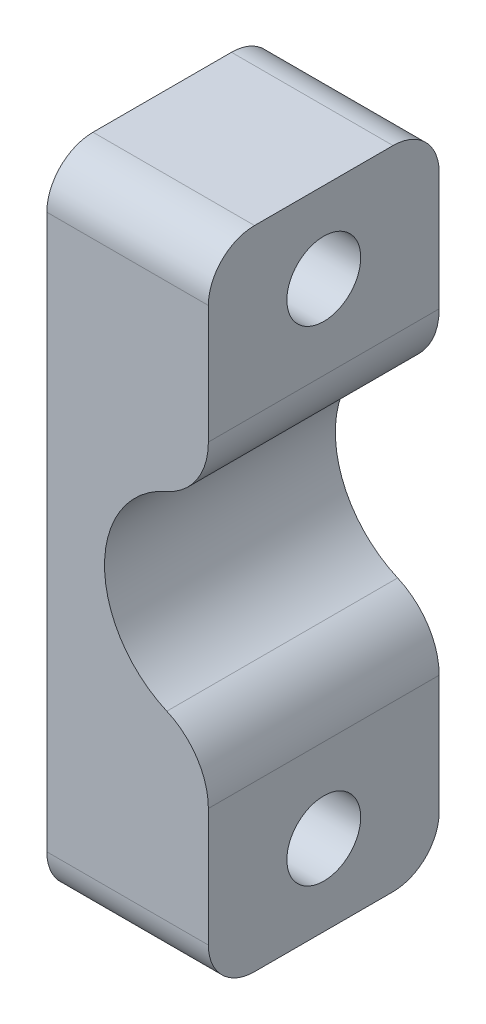
ISO-10303-21;
HEADER;
FILE_DESCRIPTION(('STEP AP214'),'2;1');
FILE_NAME('part.step','',(''),(''),'','','');
FILE_SCHEMA(('AUTOMOTIVE_DESIGN { 1 0 10303 214 1 1 1 1 }'));
ENDSEC;
DATA;
#1=APPLICATION_CONTEXT('core data for automotive mechanical design processes');
#2=APPLICATION_PROTOCOL_DEFINITION('international standard','automotive_design',2000,#1);
#3=PRODUCT_CONTEXT('',#1,'mechanical');
#4=PRODUCT('Part','Part','',(#3));
#5=PRODUCT_RELATED_PRODUCT_CATEGORY('part','',(#4));
#6=PRODUCT_DEFINITION_FORMATION('','',#4);
#7=PRODUCT_DEFINITION_CONTEXT('part definition',#1,'design');
#8=PRODUCT_DEFINITION('design','',#6,#7);
#9=PRODUCT_DEFINITION_SHAPE('','',#8);
#10=(LENGTH_UNIT() NAMED_UNIT(*) SI_UNIT(.MILLI.,.METRE.));
#11=(NAMED_UNIT(*) PLANE_ANGLE_UNIT() SI_UNIT($,.RADIAN.));
#12=(NAMED_UNIT(*) SI_UNIT($,.STERADIAN.) SOLID_ANGLE_UNIT());
#13=UNCERTAINTY_MEASURE_WITH_UNIT(LENGTH_MEASURE(1.E-05),#10,'distance_accuracy_value','');
#14=(GEOMETRIC_REPRESENTATION_CONTEXT(3) GLOBAL_UNCERTAINTY_ASSIGNED_CONTEXT((#13)) GLOBAL_UNIT_ASSIGNED_CONTEXT((#10,
#11,#12)) REPRESENTATION_CONTEXT('',''));
#15=CARTESIAN_POINT('',(0.,0.,0.));
#16=DIRECTION('',(0.,0.,1.));
#17=DIRECTION('',(1.,0.,0.));
#18=AXIS2_PLACEMENT_3D('',#15,#16,#17);
#19=CARTESIAN_POINT('',(16.8883451930902,14.,5.));
#20=DIRECTION('',(-1.,0.,0.));
#21=DIRECTION('',(0.,0.,1.));
#22=AXIS2_PLACEMENT_3D('',#19,#20,#21);
#23=PLANE('',#22);
#24=CARTESIAN_POINT('',(16.8883451930902,-10.5,0.));
#25=DIRECTION('',(1.,0.,0.));
#26=DIRECTION('',(0.,0.,-1.));
#27=AXIS2_PLACEMENT_3D('',#24,#25,#26);
#28=CIRCLE('',#27,1.6);
#29=CARTESIAN_POINT('',(16.8883451930902,-10.5,-1.6));
#30=VERTEX_POINT('',#29);
#31=EDGE_CURVE('E244',#30,#30,#28,.T.);
#32=ORIENTED_EDGE('',*,*,#31,.F.);
#33=EDGE_LOOP('',(#32));
#34=FACE_BOUND('',#33,.T.);
#35=DIRECTION('',(0.,0.,-1.));
#36=VECTOR('',#35,1.);
#37=CARTESIAN_POINT('',(16.8883451930902,-14.,5.));
#38=LINE('',#37,#36);
#39=CARTESIAN_POINT('',(16.8883451930902,-14.,3.));
#40=VERTEX_POINT('',#39);
#41=CARTESIAN_POINT('',(16.8883451930902,-14.,-3.));
#42=VERTEX_POINT('',#41);
#43=EDGE_CURVE('E159',#40,#42,#38,.T.);
#44=ORIENTED_EDGE('',*,*,#43,.T.);
#45=CARTESIAN_POINT('',(16.8883451930902,-12.,-3.));
#46=DIRECTION('',(-1.,0.,0.));
#47=DIRECTION('',(0.,0.,1.));
#48=AXIS2_PLACEMENT_3D('',#45,#46,#47);
#49=CIRCLE('',#48,2.);
#50=CARTESIAN_POINT('',(16.8883451930902,-12.,-5.));
#51=VERTEX_POINT('',#50);
#52=EDGE_CURVE('E60',#42,#51,#49,.F.);
#53=ORIENTED_EDGE('',*,*,#52,.T.);
#54=DIRECTION('',(0.,1.,0.));
#55=VECTOR('',#54,1.);
#56=CARTESIAN_POINT('',(16.8883451930902,14.,-5.));
#57=LINE('',#56,#55);
#58=CARTESIAN_POINT('',(16.8883451930902,-6.87386354243376,-5.));
#59=VERTEX_POINT('',#58);
#60=EDGE_CURVE('E128',#51,#59,#57,.T.);
#61=ORIENTED_EDGE('',*,*,#60,.T.);
#62=DIRECTION('',(0.,0.,1.));
#63=VECTOR('',#62,1.);
#64=CARTESIAN_POINT('',(16.8883451930902,-6.87386354243376,5.));
#65=LINE('',#64,#63);
#66=CARTESIAN_POINT('',(16.8883451930902,-6.87386354243376,5.));
#67=VERTEX_POINT('',#66);
#68=EDGE_CURVE('E133',#59,#67,#65,.T.);
#69=ORIENTED_EDGE('',*,*,#68,.T.);
#70=DIRECTION('',(0.,1.,0.));
#71=VECTOR('',#70,1.);
#72=CARTESIAN_POINT('',(16.8883451930902,14.,5.));
#73=LINE('',#72,#71);
#74=CARTESIAN_POINT('',(16.8883451930902,-12.,5.));
#75=VERTEX_POINT('',#74);
#76=EDGE_CURVE('E216',#75,#67,#73,.T.);
#77=ORIENTED_EDGE('',*,*,#76,.F.);
#78=CARTESIAN_POINT('',(16.8883451930902,-12.,3.));
#79=DIRECTION('',(-1.,0.,0.));
#80=DIRECTION('',(0.,0.,1.));
#81=AXIS2_PLACEMENT_3D('',#78,#79,#80);
#82=CIRCLE('',#81,2.);
#83=EDGE_CURVE('E53',#75,#40,#82,.F.);
#84=ORIENTED_EDGE('',*,*,#83,.T.);
#85=EDGE_LOOP('',(#44,#53,#61,#69,#77,#84));
#86=FACE_BOUND('',#85,.T.);
#87=ADVANCED_FACE('F37',(#34,#86),#23,.F.);
#88=CARTESIAN_POINT('',(9.8883451930902,14.,5.));
#89=DIRECTION('',(1.,0.,0.));
#90=DIRECTION('',(0.,0.,-1.));
#91=AXIS2_PLACEMENT_3D('',#88,#89,#90);
#92=PLANE('',#91);
#93=CARTESIAN_POINT('',(9.8883451930902,-10.5,0.));
#94=DIRECTION('',(1.,0.,0.));
#95=DIRECTION('',(0.,0.,-1.));
#96=AXIS2_PLACEMENT_3D('',#93,#94,#95);
#97=CIRCLE('',#96,1.6);
#98=CARTESIAN_POINT('',(9.8883451930902,-10.5,-1.6));
#99=VERTEX_POINT('',#98);
#100=EDGE_CURVE('E41',#99,#99,#97,.T.);
#101=ORIENTED_EDGE('',*,*,#100,.T.);
#102=EDGE_LOOP('',(#101));
#103=FACE_BOUND('',#102,.T.);
#104=CARTESIAN_POINT('',(9.8883451930902,10.5,0.));
#105=DIRECTION('',(1.,0.,0.));
#106=DIRECTION('',(0.,0.,-1.));
#107=AXIS2_PLACEMENT_3D('',#104,#105,#106);
#108=CIRCLE('',#107,1.6);
#109=CARTESIAN_POINT('',(9.8883451930902,10.5,-1.6));
#110=VERTEX_POINT('',#109);
#111=EDGE_CURVE('E239',#110,#110,#108,.T.);
#112=ORIENTED_EDGE('',*,*,#111,.T.);
#113=EDGE_LOOP('',(#112));
#114=FACE_BOUND('',#113,.T.);
#115=CARTESIAN_POINT('',(9.8883451930902,12.,-3.));
#116=DIRECTION('',(1.,0.,0.));
#117=DIRECTION('',(0.,0.,-1.));
#118=AXIS2_PLACEMENT_3D('',#115,#116,#117);
#119=CIRCLE('',#118,2.);
#120=CARTESIAN_POINT('',(9.8883451930902,14.,-3.));
#121=VERTEX_POINT('',#120);
#122=CARTESIAN_POINT('',(9.8883451930902,12.,-5.));
#123=VERTEX_POINT('',#122);
#124=EDGE_CURVE('E183',#121,#123,#119,.F.);
#125=ORIENTED_EDGE('',*,*,#124,.T.);
#126=DIRECTION('',(0.,-1.,0.));
#127=VECTOR('',#126,1.);
#128=CARTESIAN_POINT('',(9.8883451930902,14.,-5.));
#129=LINE('',#128,#127);
#130=CARTESIAN_POINT('',(9.8883451930902,-12.,-5.));
#131=VERTEX_POINT('',#130);
#132=EDGE_CURVE('E223',#123,#131,#129,.T.);
#133=ORIENTED_EDGE('',*,*,#132,.T.);
#134=CARTESIAN_POINT('',(9.8883451930902,-12.,-3.));
#135=DIRECTION('',(1.,0.,0.));
#136=DIRECTION('',(0.,0.,-1.));
#137=AXIS2_PLACEMENT_3D('',#134,#135,#136);
#138=CIRCLE('',#137,2.);
#139=CARTESIAN_POINT('',(9.8883451930902,-14.,-3.));
#140=VERTEX_POINT('',#139);
#141=EDGE_CURVE('E181',#131,#140,#138,.F.);
#142=ORIENTED_EDGE('',*,*,#141,.T.);
#143=DIRECTION('',(0.,0.,-1.));
#144=VECTOR('',#143,1.);
#145=CARTESIAN_POINT('',(9.8883451930902,-14.,5.));
#146=LINE('',#145,#144);
#147=CARTESIAN_POINT('',(9.8883451930902,-14.,3.));
#148=VERTEX_POINT('',#147);
#149=EDGE_CURVE('E155',#148,#140,#146,.T.);
#150=ORIENTED_EDGE('',*,*,#149,.F.);
#151=CARTESIAN_POINT('',(9.8883451930902,-12.,3.));
#152=DIRECTION('',(1.,0.,0.));
#153=DIRECTION('',(0.,0.,-1.));
#154=AXIS2_PLACEMENT_3D('',#151,#152,#153);
#155=CIRCLE('',#154,2.);
#156=CARTESIAN_POINT('',(9.8883451930902,-12.,5.));
#157=VERTEX_POINT('',#156);
#158=EDGE_CURVE('E178',#148,#157,#155,.F.);
#159=ORIENTED_EDGE('',*,*,#158,.T.);
#160=DIRECTION('',(0.,-1.,0.));
#161=VECTOR('',#160,1.);
#162=CARTESIAN_POINT('',(9.8883451930902,14.,5.));
#163=LINE('',#162,#161);
#164=CARTESIAN_POINT('',(9.8883451930902,12.,5.));
#165=VERTEX_POINT('',#164);
#166=EDGE_CURVE('E136',#165,#157,#163,.T.);
#167=ORIENTED_EDGE('',*,*,#166,.F.);
#168=CARTESIAN_POINT('',(9.8883451930902,12.,3.));
#169=DIRECTION('',(1.,0.,0.));
#170=DIRECTION('',(0.,0.,-1.));
#171=AXIS2_PLACEMENT_3D('',#168,#169,#170);
#172=CIRCLE('',#171,2.);
#173=CARTESIAN_POINT('',(9.8883451930902,14.,3.));
#174=VERTEX_POINT('',#173);
#175=EDGE_CURVE('E176',#165,#174,#172,.F.);
#176=ORIENTED_EDGE('',*,*,#175,.T.);
#177=DIRECTION('',(0.,0.,-1.));
#178=VECTOR('',#177,1.);
#179=CARTESIAN_POINT('',(9.8883451930902,14.,5.));
#180=LINE('',#179,#178);
#181=EDGE_CURVE('E222',#174,#121,#180,.T.);
#182=ORIENTED_EDGE('',*,*,#181,.T.);
#183=EDGE_LOOP('',(#125,#133,#142,#150,#159,#167,#176,#182));
#184=FACE_BOUND('',#183,.T.);
#185=ADVANCED_FACE('F210',(#103,#114,#184),#92,.F.);
#186=CARTESIAN_POINT('',(9.8883451930902,-14.,5.));
#187=DIRECTION('',(0.,1.,0.));
#188=DIRECTION('',(0.,0.,1.));
#189=AXIS2_PLACEMENT_3D('',#186,#187,#188);
#190=PLANE('',#189);
#191=ORIENTED_EDGE('',*,*,#149,.T.);
#192=DIRECTION('',(1.,0.,0.));
#193=VECTOR('',#192,1.);
#194=CARTESIAN_POINT('',(9.8883451930902,-14.,-3.));
#195=LINE('',#194,#193);
#196=EDGE_CURVE('E195',#140,#42,#195,.T.);
#197=ORIENTED_EDGE('',*,*,#196,.T.);
#198=ORIENTED_EDGE('',*,*,#43,.F.);
#199=DIRECTION('',(1.,0.,0.));
#200=VECTOR('',#199,1.);
#201=CARTESIAN_POINT('',(9.8883451930902,-14.,3.));
#202=LINE('',#201,#200);
#203=EDGE_CURVE('E193',#40,#148,#202,.F.);
#204=ORIENTED_EDGE('',*,*,#203,.T.);
#205=EDGE_LOOP('',(#191,#197,#198,#204));
#206=FACE_BOUND('',#205,.T.);
#207=ADVANCED_FACE('F230',(#206),#190,.F.);
#208=CARTESIAN_POINT('',(16.8883451930902,10.5,0.));
#209=DIRECTION('',(1.,0.,0.));
#210=DIRECTION('',(0.,0.,-1.));
#211=AXIS2_PLACEMENT_3D('',#208,#209,#210);
#212=CIRCLE('',#211,1.6);
#213=CARTESIAN_POINT('',(16.8883451930902,10.5,-1.6));
#214=VERTEX_POINT('',#213);
#215=EDGE_CURVE('E243',#214,#214,#212,.T.);
#216=ORIENTED_EDGE('',*,*,#215,.F.);
#217=EDGE_LOOP('',(#216));
#218=FACE_BOUND('',#217,.T.);
#219=CARTESIAN_POINT('',(16.8883451930902,6.87386354243376,-5.));
#220=VERTEX_POINT('',#219);
#221=CARTESIAN_POINT('',(16.8883451930902,12.,-5.));
#222=VERTEX_POINT('',#221);
#223=EDGE_CURVE('E137',#220,#222,#57,.T.);
#224=ORIENTED_EDGE('',*,*,#223,.T.);
#225=CARTESIAN_POINT('',(16.8883451930902,12.,-3.));
#226=DIRECTION('',(-1.,0.,0.));
#227=DIRECTION('',(0.,0.,1.));
#228=AXIS2_PLACEMENT_3D('',#225,#226,#227);
#229=CIRCLE('',#228,2.);
#230=CARTESIAN_POINT('',(16.8883451930902,14.,-3.));
#231=VERTEX_POINT('',#230);
#232=EDGE_CURVE('E191',#222,#231,#229,.F.);
#233=ORIENTED_EDGE('',*,*,#232,.T.);
#234=DIRECTION('',(0.,0.,-1.));
#235=VECTOR('',#234,1.);
#236=CARTESIAN_POINT('',(16.8883451930902,14.,5.));
#237=LINE('',#236,#235);
#238=CARTESIAN_POINT('',(16.8883451930902,14.,3.));
#239=VERTEX_POINT('',#238);
#240=EDGE_CURVE('E226',#239,#231,#237,.T.);
#241=ORIENTED_EDGE('',*,*,#240,.F.);
#242=CARTESIAN_POINT('',(16.8883451930902,12.,3.));
#243=DIRECTION('',(-1.,0.,0.));
#244=DIRECTION('',(0.,0.,1.));
#245=AXIS2_PLACEMENT_3D('',#242,#243,#244);
#246=CIRCLE('',#245,2.);
#247=CARTESIAN_POINT('',(16.8883451930902,12.,5.));
#248=VERTEX_POINT('',#247);
#249=EDGE_CURVE('E189',#239,#248,#246,.F.);
#250=ORIENTED_EDGE('',*,*,#249,.T.);
#251=CARTESIAN_POINT('',(16.8883451930902,6.87386354243376,5.));
#252=VERTEX_POINT('',#251);
#253=EDGE_CURVE('E206',#252,#248,#73,.T.);
#254=ORIENTED_EDGE('',*,*,#253,.F.);
#255=DIRECTION('',(0.,0.,1.));
#256=VECTOR('',#255,1.);
#257=CARTESIAN_POINT('',(16.8883451930902,6.87386354243376,5.));
#258=LINE('',#257,#256);
#259=EDGE_CURVE('E148',#252,#220,#258,.F.);
#260=ORIENTED_EDGE('',*,*,#259,.T.);
#261=EDGE_LOOP('',(#224,#233,#241,#250,#254,#260));
#262=FACE_BOUND('',#261,.T.);
#263=ADVANCED_FACE('F253',(#218,#262),#23,.F.);
#264=CARTESIAN_POINT('',(9.8883451930902,14.,5.));
#265=DIRECTION('',(0.,-1.,0.));
#266=DIRECTION('',(0.,0.,-1.));
#267=AXIS2_PLACEMENT_3D('',#264,#265,#266);
#268=PLANE('',#267);
#269=ORIENTED_EDGE('',*,*,#240,.T.);
#270=DIRECTION('',(-1.,0.,0.));
#271=VECTOR('',#270,1.);
#272=CARTESIAN_POINT('',(9.8883451930902,14.,-3.));
#273=LINE('',#272,#271);
#274=EDGE_CURVE('E173',#231,#121,#273,.T.);
#275=ORIENTED_EDGE('',*,*,#274,.T.);
#276=ORIENTED_EDGE('',*,*,#181,.F.);
#277=DIRECTION('',(-1.,0.,0.));
#278=VECTOR('',#277,1.);
#279=CARTESIAN_POINT('',(16.8883451930902,14.,3.));
#280=LINE('',#279,#278);
#281=EDGE_CURVE('E171',#174,#239,#280,.F.);
#282=ORIENTED_EDGE('',*,*,#281,.T.);
#283=EDGE_LOOP('',(#269,#275,#276,#282));
#284=FACE_BOUND('',#283,.T.);
#285=ADVANCED_FACE('F256',(#284),#268,.F.);
#286=CARTESIAN_POINT('',(0.,0.,5.));
#287=DIRECTION('',(0.,0.,1.));
#288=DIRECTION('',(1.,0.,0.));
#289=AXIS2_PLACEMENT_3D('',#286,#287,#288);
#290=PLANE('',#289);
#291=ORIENTED_EDGE('',*,*,#166,.T.);
#292=DIRECTION('',(1.,0.,0.));
#293=VECTOR('',#292,1.);
#294=CARTESIAN_POINT('',(16.8883451930902,-12.,5.));
#295=LINE('',#294,#293);
#296=EDGE_CURVE('E11',#157,#75,#295,.T.);
#297=ORIENTED_EDGE('',*,*,#296,.T.);
#298=ORIENTED_EDGE('',*,*,#76,.T.);
#299=CARTESIAN_POINT('',(13.8883451930902,-6.87386354243376,5.));
#300=DIRECTION('',(0.,0.,1.));
#301=DIRECTION('',(1.,0.,0.));
#302=AXIS2_PLACEMENT_3D('',#299,#300,#301);
#303=CIRCLE('',#302,3.);
#304=CARTESIAN_POINT('',(15.0883451930902,-4.12431812546026,5.));
#305=VERTEX_POINT('',#304);
#306=EDGE_CURVE('E153',#67,#305,#303,.T.);
#307=ORIENTED_EDGE('',*,*,#306,.T.);
#308=CARTESIAN_POINT('',(16.8883451930902,0.,5.));
#309=DIRECTION('',(0.,0.,1.));
#310=DIRECTION('',(1.,0.,0.));
#311=AXIS2_PLACEMENT_3D('',#308,#309,#310);
#312=CIRCLE('',#311,4.5);
#313=CARTESIAN_POINT('',(15.0883451930902,4.12431812546026,5.));
#314=VERTEX_POINT('',#313);
#315=EDGE_CURVE('E219',#314,#305,#312,.T.);
#316=ORIENTED_EDGE('',*,*,#315,.F.);
#317=CARTESIAN_POINT('',(13.8883451930902,6.87386354243376,5.));
#318=DIRECTION('',(0.,0.,1.));
#319=DIRECTION('',(1.,0.,0.));
#320=AXIS2_PLACEMENT_3D('',#317,#318,#319);
#321=CIRCLE('',#320,3.);
#322=EDGE_CURVE('E154',#314,#252,#321,.T.);
#323=ORIENTED_EDGE('',*,*,#322,.T.);
#324=ORIENTED_EDGE('',*,*,#253,.T.);
#325=DIRECTION('',(-1.,0.,0.));
#326=VECTOR('',#325,1.);
#327=CARTESIAN_POINT('',(9.8883451930902,12.,5.));
#328=LINE('',#327,#326);
#329=EDGE_CURVE('E46',#248,#165,#328,.T.);
#330=ORIENTED_EDGE('',*,*,#329,.T.);
#331=EDGE_LOOP('',(#291,#297,#298,#307,#316,#323,#324,#330));
#332=FACE_BOUND('',#331,.T.);
#333=ADVANCED_FACE('F204',(#332),#290,.T.);
#334=CARTESIAN_POINT('',(0.,0.,-5.));
#335=DIRECTION('',(0.,0.,1.));
#336=DIRECTION('',(1.,0.,0.));
#337=AXIS2_PLACEMENT_3D('',#334,#335,#336);
#338=PLANE('',#337);
#339=ORIENTED_EDGE('',*,*,#132,.F.);
#340=DIRECTION('',(-1.,0.,0.));
#341=VECTOR('',#340,1.);
#342=CARTESIAN_POINT('',(0.,12.,-5.));
#343=LINE('',#342,#341);
#344=EDGE_CURVE('E187',#123,#222,#343,.F.);
#345=ORIENTED_EDGE('',*,*,#344,.T.);
#346=ORIENTED_EDGE('',*,*,#223,.F.);
#347=CARTESIAN_POINT('',(13.8883451930902,6.87386354243376,-5.));
#348=DIRECTION('',(0.,0.,1.));
#349=DIRECTION('',(1.,0.,0.));
#350=AXIS2_PLACEMENT_3D('',#347,#348,#349);
#351=CIRCLE('',#350,3.);
#352=CARTESIAN_POINT('',(15.0883451930902,4.12431812546026,-5.));
#353=VERTEX_POINT('',#352);
#354=EDGE_CURVE('E149',#220,#353,#351,.F.);
#355=ORIENTED_EDGE('',*,*,#354,.T.);
#356=CARTESIAN_POINT('',(16.8883451930902,0.,-5.));
#357=DIRECTION('',(0.,0.,1.));
#358=DIRECTION('',(1.,0.,0.));
#359=AXIS2_PLACEMENT_3D('',#356,#357,#358);
#360=CIRCLE('',#359,4.5);
#361=CARTESIAN_POINT('',(15.0883451930902,-4.12431812546026,-5.));
#362=VERTEX_POINT('',#361);
#363=EDGE_CURVE('E145',#353,#362,#360,.T.);
#364=ORIENTED_EDGE('',*,*,#363,.T.);
#365=CARTESIAN_POINT('',(13.8883451930902,-6.87386354243376,-5.));
#366=DIRECTION('',(0.,0.,1.));
#367=DIRECTION('',(1.,0.,0.));
#368=AXIS2_PLACEMENT_3D('',#365,#366,#367);
#369=CIRCLE('',#368,3.);
#370=EDGE_CURVE('E141',#362,#59,#369,.F.);
#371=ORIENTED_EDGE('',*,*,#370,.T.);
#372=ORIENTED_EDGE('',*,*,#60,.F.);
#373=DIRECTION('',(1.,0.,0.));
#374=VECTOR('',#373,1.);
#375=CARTESIAN_POINT('',(0.,-12.,-5.));
#376=LINE('',#375,#374);
#377=EDGE_CURVE('E185',#51,#131,#376,.F.);
#378=ORIENTED_EDGE('',*,*,#377,.T.);
#379=EDGE_LOOP('',(#339,#345,#346,#355,#364,#371,#372,#378));
#380=FACE_BOUND('',#379,.T.);
#381=ADVANCED_FACE('F143',(#380),#338,.F.);
#382=CARTESIAN_POINT('',(16.8883451930902,0.,-5.));
#383=DIRECTION('',(0.,0.,1.));
#384=DIRECTION('',(1.,0.,0.));
#385=AXIS2_PLACEMENT_3D('',#382,#383,#384);
#386=CYLINDRICAL_SURFACE('',#385,4.5);
#387=ORIENTED_EDGE('',*,*,#315,.T.);
#388=DIRECTION('',(0.,0.,1.));
#389=VECTOR('',#388,1.);
#390=CARTESIAN_POINT('',(15.0883451930902,-4.12431812546026,-5.));
#391=LINE('',#390,#389);
#392=EDGE_CURVE('E166',#305,#362,#391,.F.);
#393=ORIENTED_EDGE('',*,*,#392,.T.);
#394=ORIENTED_EDGE('',*,*,#363,.F.);
#395=DIRECTION('',(0.,0.,1.));
#396=VECTOR('',#395,1.);
#397=CARTESIAN_POINT('',(15.0883451930902,4.12431812546026,-5.));
#398=LINE('',#397,#396);
#399=EDGE_CURVE('E164',#353,#314,#398,.T.);
#400=ORIENTED_EDGE('',*,*,#399,.T.);
#401=EDGE_LOOP('',(#387,#393,#394,#400));
#402=FACE_BOUND('',#401,.T.);
#403=ADVANCED_FACE('F236',(#402),#386,.F.);
#404=CARTESIAN_POINT('',(13.8883451930902,-6.87386354243376,-5.));
#405=DIRECTION('',(0.,0.,1.));
#406=DIRECTION('',(1.,0.,0.));
#407=AXIS2_PLACEMENT_3D('',#404,#405,#406);
#408=CYLINDRICAL_SURFACE('',#407,3.);
#409=ORIENTED_EDGE('',*,*,#370,.F.);
#410=ORIENTED_EDGE('',*,*,#392,.F.);
#411=ORIENTED_EDGE('',*,*,#306,.F.);
#412=ORIENTED_EDGE('',*,*,#68,.F.);
#413=EDGE_LOOP('',(#409,#410,#411,#412));
#414=FACE_BOUND('',#413,.T.);
#415=ADVANCED_FACE('F152',(#414),#408,.T.);
#416=CARTESIAN_POINT('',(13.8883451930902,6.87386354243376,-5.));
#417=DIRECTION('',(0.,0.,1.));
#418=DIRECTION('',(1.,0.,0.));
#419=AXIS2_PLACEMENT_3D('',#416,#417,#418);
#420=CYLINDRICAL_SURFACE('',#419,3.);
#421=ORIENTED_EDGE('',*,*,#322,.F.);
#422=ORIENTED_EDGE('',*,*,#399,.F.);
#423=ORIENTED_EDGE('',*,*,#354,.F.);
#424=ORIENTED_EDGE('',*,*,#259,.F.);
#425=EDGE_LOOP('',(#421,#422,#423,#424));
#426=FACE_BOUND('',#425,.T.);
#427=ADVANCED_FACE('F277',(#426),#420,.T.);
#428=CARTESIAN_POINT('',(9.8883451930902,12.,-3.));
#429=DIRECTION('',(-1.,0.,0.));
#430=DIRECTION('',(0.,0.,1.));
#431=AXIS2_PLACEMENT_3D('',#428,#429,#430);
#432=CYLINDRICAL_SURFACE('',#431,2.);
#433=ORIENTED_EDGE('',*,*,#232,.F.);
#434=ORIENTED_EDGE('',*,*,#344,.F.);
#435=ORIENTED_EDGE('',*,*,#124,.F.);
#436=ORIENTED_EDGE('',*,*,#274,.F.);
#437=EDGE_LOOP('',(#433,#434,#435,#436));
#438=FACE_BOUND('',#437,.T.);
#439=ADVANCED_FACE('F266',(#438),#432,.T.);
#440=CARTESIAN_POINT('',(9.8883451930902,-12.,-3.));
#441=DIRECTION('',(1.,0.,0.));
#442=DIRECTION('',(0.,0.,-1.));
#443=AXIS2_PLACEMENT_3D('',#440,#441,#442);
#444=CYLINDRICAL_SURFACE('',#443,2.);
#445=ORIENTED_EDGE('',*,*,#141,.F.);
#446=ORIENTED_EDGE('',*,*,#377,.F.);
#447=ORIENTED_EDGE('',*,*,#52,.F.);
#448=ORIENTED_EDGE('',*,*,#196,.F.);
#449=EDGE_LOOP('',(#445,#446,#447,#448));
#450=FACE_BOUND('',#449,.T.);
#451=ADVANCED_FACE('F270',(#450),#444,.T.);
#452=CARTESIAN_POINT('',(0.,-12.,3.));
#453=DIRECTION('',(-1.,0.,0.));
#454=DIRECTION('',(0.,0.,1.));
#455=AXIS2_PLACEMENT_3D('',#452,#453,#454);
#456=CYLINDRICAL_SURFACE('',#455,2.);
#457=ORIENTED_EDGE('',*,*,#158,.F.);
#458=ORIENTED_EDGE('',*,*,#203,.F.);
#459=ORIENTED_EDGE('',*,*,#83,.F.);
#460=ORIENTED_EDGE('',*,*,#296,.F.);
#461=EDGE_LOOP('',(#457,#458,#459,#460));
#462=FACE_BOUND('',#461,.T.);
#463=ADVANCED_FACE('F231',(#462),#456,.T.);
#464=CARTESIAN_POINT('',(0.,12.,3.));
#465=DIRECTION('',(1.,0.,0.));
#466=DIRECTION('',(0.,0.,-1.));
#467=AXIS2_PLACEMENT_3D('',#464,#465,#466);
#468=CYLINDRICAL_SURFACE('',#467,2.);
#469=ORIENTED_EDGE('',*,*,#249,.F.);
#470=ORIENTED_EDGE('',*,*,#281,.F.);
#471=ORIENTED_EDGE('',*,*,#175,.F.);
#472=ORIENTED_EDGE('',*,*,#329,.F.);
#473=EDGE_LOOP('',(#469,#470,#471,#472));
#474=FACE_BOUND('',#473,.T.);
#475=ADVANCED_FACE('F39',(#474),#468,.T.);
#476=CARTESIAN_POINT('',(0.888345193090202,10.5,0.));
#477=DIRECTION('',(1.,0.,0.));
#478=DIRECTION('',(0.,0.,-1.));
#479=AXIS2_PLACEMENT_3D('',#476,#477,#478);
#480=CYLINDRICAL_SURFACE('',#479,1.6);
#481=ORIENTED_EDGE('',*,*,#215,.T.);
#482=EDGE_LOOP('',(#481));
#483=FACE_BOUND('',#482,.T.);
#484=ORIENTED_EDGE('',*,*,#111,.F.);
#485=EDGE_LOOP('',(#484));
#486=FACE_BOUND('',#485,.T.);
#487=ADVANCED_FACE('F250',(#483,#486),#480,.F.);
#488=CARTESIAN_POINT('',(0.888345193090202,-10.5,0.));
#489=DIRECTION('',(1.,0.,0.));
#490=DIRECTION('',(0.,0.,-1.));
#491=AXIS2_PLACEMENT_3D('',#488,#489,#490);
#492=CYLINDRICAL_SURFACE('',#491,1.6);
#493=ORIENTED_EDGE('',*,*,#31,.T.);
#494=EDGE_LOOP('',(#493));
#495=FACE_BOUND('',#494,.T.);
#496=ORIENTED_EDGE('',*,*,#100,.F.);
#497=EDGE_LOOP('',(#496));
#498=FACE_BOUND('',#497,.T.);
#499=ADVANCED_FACE('F302',(#495,#498),#492,.F.);
#500=CLOSED_SHELL('',(#87,#185,#207,#263,#285,#333,#381,#403,#415,#427,#439,#451,#463,#475,#487,#499));
#501=MANIFOLD_SOLID_BREP('B2',#500);
#502=ADVANCED_BREP_SHAPE_REPRESENTATION('',(#18,#501),#14);
#503=SHAPE_DEFINITION_REPRESENTATION(#9,#502);
ENDSEC;
END-ISO-10303-21;
